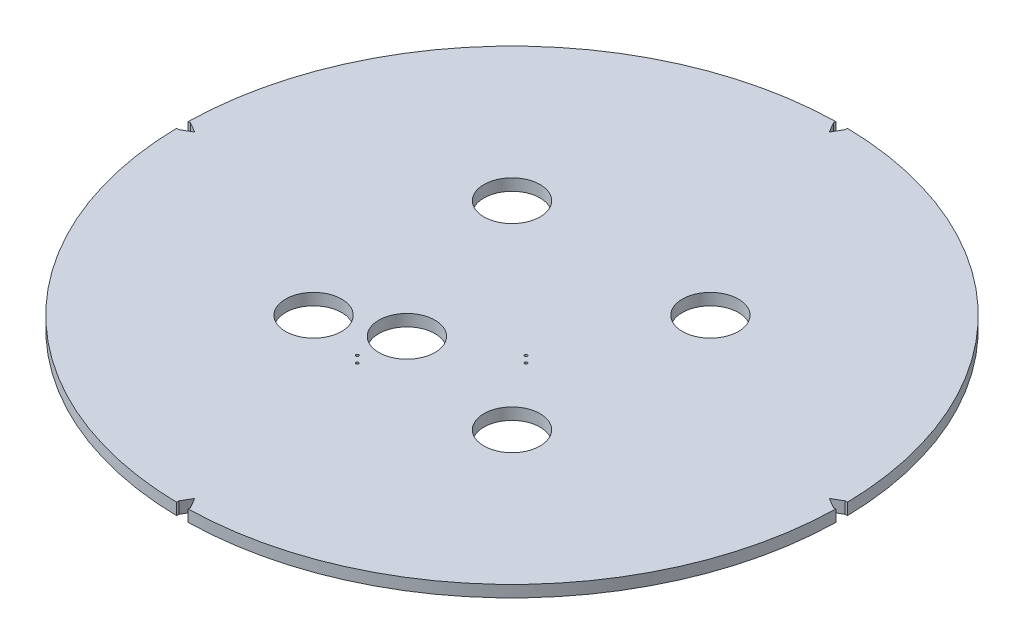
ISO-10303-21;
HEADER;
FILE_DESCRIPTION(('STEP AP214'),'2;1');
FILE_NAME('part.step','',(''),(''),'','','');
FILE_SCHEMA(('AUTOMOTIVE_DESIGN { 1 0 10303 214 1 1 1 1 }'));
ENDSEC;
DATA;
#1=APPLICATION_CONTEXT('core data for automotive mechanical design processes');
#2=APPLICATION_PROTOCOL_DEFINITION('international standard','automotive_design',2000,#1);
#3=PRODUCT_CONTEXT('',#1,'mechanical');
#4=PRODUCT('Part','Part','',(#3));
#5=PRODUCT_RELATED_PRODUCT_CATEGORY('part','',(#4));
#6=PRODUCT_DEFINITION_FORMATION('','',#4);
#7=PRODUCT_DEFINITION_CONTEXT('part definition',#1,'design');
#8=PRODUCT_DEFINITION('design','',#6,#7);
#9=PRODUCT_DEFINITION_SHAPE('','',#8);
#10=(LENGTH_UNIT() NAMED_UNIT(*) SI_UNIT(.MILLI.,.METRE.));
#11=(NAMED_UNIT(*) PLANE_ANGLE_UNIT() SI_UNIT($,.RADIAN.));
#12=(NAMED_UNIT(*) SI_UNIT($,.STERADIAN.) SOLID_ANGLE_UNIT());
#13=UNCERTAINTY_MEASURE_WITH_UNIT(LENGTH_MEASURE(1.E-05),#10,'distance_accuracy_value','');
#14=(GEOMETRIC_REPRESENTATION_CONTEXT(3) GLOBAL_UNCERTAINTY_ASSIGNED_CONTEXT((#13)) GLOBAL_UNIT_ASSIGNED_CONTEXT((#10,
#11,#12)) REPRESENTATION_CONTEXT('',''));
#15=CARTESIAN_POINT('',(0.,0.,0.));
#16=DIRECTION('',(0.,0.,1.));
#17=DIRECTION('',(1.,0.,0.));
#18=AXIS2_PLACEMENT_3D('',#15,#16,#17);
#19=CARTESIAN_POINT('',(0.,25.,0.));
#20=DIRECTION('',(0.,1.,0.));
#21=DIRECTION('',(0.,0.,1.));
#22=AXIS2_PLACEMENT_3D('',#19,#20,#21);
#23=PLANE('',#22);
#24=DIRECTION('',(1.,0.,0.));
#25=VECTOR('',#24,1.);
#26=CARTESIAN_POINT('',(-699.994189271292,25.,12.4999999999935));
#27=LINE('',#26,#25);
#28=CARTESIAN_POINT('',(-704.889175686505,25.,12.4999999999935));
#29=VERTEX_POINT('',#28);
#30=CARTESIAN_POINT('',(-699.994189271292,25.,12.4999999999935));
#31=VERTEX_POINT('',#30);
#32=EDGE_CURVE('E214',#29,#31,#27,.T.);
#33=ORIENTED_EDGE('',*,*,#32,.F.);
#34=CARTESIAN_POINT('',(0.,25.,0.));
#35=DIRECTION('',(0.,1.,0.));
#36=DIRECTION('',(0.,0.,1.));
#37=AXIS2_PLACEMENT_3D('',#34,#35,#36);
#38=CIRCLE('',#37,705.);
#39=CARTESIAN_POINT('',(-12.5000000000039,25.,704.889175686505));
#40=VERTEX_POINT('',#39);
#41=EDGE_CURVE('E45',#29,#40,#38,.T.);
#42=ORIENTED_EDGE('',*,*,#41,.T.);
#43=DIRECTION('',(0.,0.,1.));
#44=VECTOR('',#43,1.);
#45=CARTESIAN_POINT('',(-12.5000000000039,25.,699.994189271326));
#46=LINE('',#45,#44);
#47=CARTESIAN_POINT('',(-12.5000000000039,25.,699.994189271326));
#48=VERTEX_POINT('',#47);
#49=EDGE_CURVE('E295',#48,#40,#46,.T.);
#50=ORIENTED_EDGE('',*,*,#49,.F.);
#51=DIRECTION('',(-0.500000000000008,0.,0.866025403784434));
#52=VECTOR('',#51,1.);
#53=CARTESIAN_POINT('',(1.75263706108031E-11,25.,678.343554176678));
#54=LINE('',#53,#52);
#55=CARTESIAN_POINT('',(1.75263706108031E-11,25.,678.343554176678));
#56=VERTEX_POINT('',#55);
#57=EDGE_CURVE('E292',#56,#48,#54,.T.);
#58=ORIENTED_EDGE('',*,*,#57,.F.);
#59=DIRECTION('',(-0.499999999999294,0.,-0.866025403784846));
#60=VECTOR('',#59,1.);
#61=CARTESIAN_POINT('',(12.499999999996,25.,699.994189271292));
#62=LINE('',#61,#60);
#63=CARTESIAN_POINT('',(12.499999999996,25.,699.994189271292));
#64=VERTEX_POINT('',#63);
#65=EDGE_CURVE('E301',#64,#56,#62,.T.);
#66=ORIENTED_EDGE('',*,*,#65,.F.);
#67=DIRECTION('',(0.,0.,-1.));
#68=VECTOR('',#67,1.);
#69=CARTESIAN_POINT('',(12.499999999996,25.,699.994189271292));
#70=LINE('',#69,#68);
#71=CARTESIAN_POINT('',(12.499999999996,25.,704.889175686505));
#72=VERTEX_POINT('',#71);
#73=EDGE_CURVE('E298',#72,#64,#70,.T.);
#74=ORIENTED_EDGE('',*,*,#73,.F.);
#75=CARTESIAN_POINT('',(704.889175686504,25.,12.5000000000113));
#76=VERTEX_POINT('',#75);
#77=EDGE_CURVE('E11',#72,#76,#38,.T.);
#78=ORIENTED_EDGE('',*,*,#77,.T.);
#79=DIRECTION('',(1.,0.,0.));
#80=VECTOR('',#79,1.);
#81=CARTESIAN_POINT('',(699.994189271326,25.,12.5000000000112));
#82=LINE('',#81,#80);
#83=CARTESIAN_POINT('',(699.994189271326,25.,12.5000000000112));
#84=VERTEX_POINT('',#83);
#85=EDGE_CURVE('E264',#84,#76,#82,.T.);
#86=ORIENTED_EDGE('',*,*,#85,.F.);
#87=DIRECTION('',(0.866025403784428,0.,0.500000000000017));
#88=VECTOR('',#87,1.);
#89=CARTESIAN_POINT('',(678.343554176678,25.,-1.04210990286059E-11));
#90=LINE('',#89,#88);
#91=CARTESIAN_POINT('',(678.343554176678,25.,-1.04210990286059E-11));
#92=VERTEX_POINT('',#91);
#93=EDGE_CURVE('E261',#92,#84,#90,.T.);
#94=ORIENTED_EDGE('',*,*,#93,.F.);
#95=DIRECTION('',(-0.866025403784851,0.,0.499999999999285));
#96=VECTOR('',#95,1.);
#97=CARTESIAN_POINT('',(699.994189271293,25.,-12.4999999999887));
#98=LINE('',#97,#96);
#99=CARTESIAN_POINT('',(699.994189271293,25.,-12.4999999999887));
#100=VERTEX_POINT('',#99);
#101=EDGE_CURVE('E269',#100,#92,#98,.T.);
#102=ORIENTED_EDGE('',*,*,#101,.F.);
#103=DIRECTION('',(-1.,0.,0.));
#104=VECTOR('',#103,1.);
#105=CARTESIAN_POINT('',(699.994189271293,25.,-12.4999999999887));
#106=LINE('',#105,#104);
#107=CARTESIAN_POINT('',(704.889175686505,25.,-12.4999999999886));
#108=VERTEX_POINT('',#107);
#109=EDGE_CURVE('E266',#108,#100,#106,.T.);
#110=ORIENTED_EDGE('',*,*,#109,.F.);
#111=CARTESIAN_POINT('',(12.5000000000039,25.,-704.889175686505));
#112=VERTEX_POINT('',#111);
#113=EDGE_CURVE('E43',#108,#112,#38,.T.);
#114=ORIENTED_EDGE('',*,*,#113,.T.);
#115=DIRECTION('',(0.,0.,-1.));
#116=VECTOR('',#115,1.);
#117=CARTESIAN_POINT('',(12.5000000000039,25.,-699.994189271326));
#118=LINE('',#117,#116);
#119=CARTESIAN_POINT('',(12.5000000000039,25.,-699.994189271326));
#120=VERTEX_POINT('',#119);
#121=EDGE_CURVE('E237',#120,#112,#118,.T.);
#122=ORIENTED_EDGE('',*,*,#121,.F.);
#123=DIRECTION('',(0.500000000000008,0.,-0.866025403784434));
#124=VECTOR('',#123,1.);
#125=CARTESIAN_POINT('',(-1.75263706108031E-11,25.,-678.343554176678));
#126=LINE('',#125,#124);
#127=CARTESIAN_POINT('',(-1.75263706108031E-11,25.,-678.343554176678));
#128=VERTEX_POINT('',#127);
#129=EDGE_CURVE('E234',#128,#120,#126,.T.);
#130=ORIENTED_EDGE('',*,*,#129,.F.);
#131=DIRECTION('',(0.499999999999294,0.,0.866025403784846));
#132=VECTOR('',#131,1.);
#133=CARTESIAN_POINT('',(-12.499999999996,25.,-699.994189271292));
#134=LINE('',#133,#132);
#135=CARTESIAN_POINT('',(-12.499999999996,25.,-699.994189271292));
#136=VERTEX_POINT('',#135);
#137=EDGE_CURVE('E242',#136,#128,#134,.T.);
#138=ORIENTED_EDGE('',*,*,#137,.F.);
#139=DIRECTION('',(0.,0.,1.));
#140=VECTOR('',#139,1.);
#141=CARTESIAN_POINT('',(-12.499999999996,25.,-699.994189271292));
#142=LINE('',#141,#140);
#143=CARTESIAN_POINT('',(-12.499999999996,25.,-704.889175686505));
#144=VERTEX_POINT('',#143);
#145=EDGE_CURVE('E239',#144,#136,#142,.T.);
#146=ORIENTED_EDGE('',*,*,#145,.F.);
#147=CARTESIAN_POINT('',(-704.889175686505,25.,-12.5000000000064));
#148=VERTEX_POINT('',#147);
#149=EDGE_CURVE('E324',#144,#148,#38,.T.);
#150=ORIENTED_EDGE('',*,*,#149,.T.);
#151=DIRECTION('',(-1.,0.,0.));
#152=VECTOR('',#151,1.);
#153=CARTESIAN_POINT('',(-699.994189271326,25.,-12.5000000000063));
#154=LINE('',#153,#152);
#155=CARTESIAN_POINT('',(-699.994189271326,25.,-12.5000000000063));
#156=VERTEX_POINT('',#155);
#157=EDGE_CURVE('E212',#156,#148,#154,.T.);
#158=ORIENTED_EDGE('',*,*,#157,.F.);
#159=DIRECTION('',(-0.866025403784432,0.,-0.500000000000011));
#160=VECTOR('',#159,1.);
#161=CARTESIAN_POINT('',(-678.343554176678,25.,1.51579467500707E-11));
#162=LINE('',#161,#160);
#163=CARTESIAN_POINT('',(-678.343554176678,25.,1.51579467500707E-11));
#164=VERTEX_POINT('',#163);
#165=EDGE_CURVE('E182',#164,#156,#162,.T.);
#166=ORIENTED_EDGE('',*,*,#165,.F.);
#167=DIRECTION('',(0.866025403784848,0.,-0.499999999999291));
#168=VECTOR('',#167,1.);
#169=CARTESIAN_POINT('',(-699.994189271292,25.,12.4999999999935));
#170=LINE('',#169,#168);
#171=EDGE_CURVE('E184',#31,#164,#170,.T.);
#172=ORIENTED_EDGE('',*,*,#171,.F.);
#173=EDGE_LOOP('',(#33,#42,#50,#58,#66,#74,#78,#86,#94,#102,#110,#114,#122,#130,#138,#146,#150,
#158,#166,#172));
#174=FACE_BOUND('',#173,.T.);
#175=CARTESIAN_POINT('',(212.132034355964,25.,212.132034355964));
#176=DIRECTION('',(0.,1.,0.));
#177=DIRECTION('',(0.,0.,1.));
#178=AXIS2_PLACEMENT_3D('',#175,#176,#177);
#179=CIRCLE('',#178,60.);
#180=CARTESIAN_POINT('',(212.132034355964,25.,272.132034355964));
#181=VERTEX_POINT('',#180);
#182=EDGE_CURVE('E521',#181,#181,#179,.T.);
#183=ORIENTED_EDGE('',*,*,#182,.F.);
#184=EDGE_LOOP('',(#183));
#185=FACE_BOUND('',#184,.T.);
#186=CARTESIAN_POINT('',(-212.132034355964,25.,212.132034355964));
#187=DIRECTION('',(0.,1.,0.));
#188=DIRECTION('',(0.,0.,1.));
#189=AXIS2_PLACEMENT_3D('',#186,#187,#188);
#190=CIRCLE('',#189,60.);
#191=CARTESIAN_POINT('',(-212.132034355964,25.,272.132034355964));
#192=VERTEX_POINT('',#191);
#193=EDGE_CURVE('E514',#192,#192,#190,.T.);
#194=ORIENTED_EDGE('',*,*,#193,.F.);
#195=EDGE_LOOP('',(#194));
#196=FACE_BOUND('',#195,.T.);
#197=CARTESIAN_POINT('',(-212.132034355964,25.,-212.132034355964));
#198=DIRECTION('',(0.,1.,0.));
#199=DIRECTION('',(0.,0.,1.));
#200=AXIS2_PLACEMENT_3D('',#197,#198,#199);
#201=CIRCLE('',#200,60.);
#202=CARTESIAN_POINT('',(-212.132034355964,25.,-152.132034355964));
#203=VERTEX_POINT('',#202);
#204=EDGE_CURVE('E522',#203,#203,#201,.T.);
#205=ORIENTED_EDGE('',*,*,#204,.F.);
#206=EDGE_LOOP('',(#205));
#207=FACE_BOUND('',#206,.T.);
#208=CARTESIAN_POINT('',(212.132034355964,25.,-212.132034355964));
#209=DIRECTION('',(0.,1.,0.));
#210=DIRECTION('',(0.,0.,1.));
#211=AXIS2_PLACEMENT_3D('',#208,#209,#210);
#212=CIRCLE('',#211,60.);
#213=CARTESIAN_POINT('',(212.132034355964,25.,-152.132034355964));
#214=VERTEX_POINT('',#213);
#215=EDGE_CURVE('E528',#214,#214,#212,.T.);
#216=ORIENTED_EDGE('',*,*,#215,.F.);
#217=EDGE_LOOP('',(#216));
#218=FACE_BOUND('',#217,.T.);
#219=CARTESIAN_POINT('',(-73.3699843446907,25.,151.389388342512));
#220=DIRECTION('',(0.,1.,0.));
#221=DIRECTION('',(0.,0.,1.));
#222=AXIS2_PLACEMENT_3D('',#219,#220,#221);
#223=CIRCLE('',#222,60.);
#224=CARTESIAN_POINT('',(-73.3699843446907,25.,211.389388342512));
#225=VERTEX_POINT('',#224);
#226=EDGE_CURVE('E503',#225,#225,#223,.T.);
#227=ORIENTED_EDGE('',*,*,#226,.F.);
#228=EDGE_LOOP('',(#227));
#229=FACE_BOUND('',#228,.T.);
#230=CARTESIAN_POINT('',(89.2645753282152,25.,59.465506788261));
#231=DIRECTION('',(0.,-1.,0.));
#232=DIRECTION('',(0.,0.,-1.));
#233=AXIS2_PLACEMENT_3D('',#230,#231,#232);
#234=CIRCLE('',#233,3.00000000000001);
#235=CARTESIAN_POINT('',(89.2645753282152,25.,56.465506788261));
#236=VERTEX_POINT('',#235);
#237=EDGE_CURVE('E507',#236,#236,#234,.T.);
#238=ORIENTED_EDGE('',*,*,#237,.T.);
#239=EDGE_LOOP('',(#238));
#240=FACE_BOUND('',#239,.T.);
#241=CARTESIAN_POINT('',(103.406710951946,25.,73.607642411992));
#242=DIRECTION('',(0.,-1.,0.));
#243=DIRECTION('',(0.,0.,-1.));
#244=AXIS2_PLACEMENT_3D('',#241,#242,#243);
#245=CIRCLE('',#244,3.00000000000001);
#246=CARTESIAN_POINT('',(103.406710951946,25.,70.607642411992));
#247=VERTEX_POINT('',#246);
#248=EDGE_CURVE('E500',#247,#247,#245,.T.);
#249=ORIENTED_EDGE('',*,*,#248,.T.);
#250=EDGE_LOOP('',(#249));
#251=FACE_BOUND('',#250,.T.);
#252=CARTESIAN_POINT('',(-76.9055182506234,25.,253.919871614562));
#253=DIRECTION('',(0.,1.,0.));
#254=DIRECTION('',(0.,0.,1.));
#255=AXIS2_PLACEMENT_3D('',#252,#253,#254);
#256=CIRCLE('',#255,3.00000000000001);
#257=CARTESIAN_POINT('',(-76.9055182506234,25.,256.919871614562));
#258=VERTEX_POINT('',#257);
#259=EDGE_CURVE('E490',#258,#258,#256,.T.);
#260=ORIENTED_EDGE('',*,*,#259,.F.);
#261=EDGE_LOOP('',(#260));
#262=FACE_BOUND('',#261,.T.);
#263=CARTESIAN_POINT('',(-91.0476538743544,25.,239.777735990831));
#264=DIRECTION('',(0.,1.,0.));
#265=DIRECTION('',(0.,0.,1.));
#266=AXIS2_PLACEMENT_3D('',#263,#264,#265);
#267=CIRCLE('',#266,3.00000000000002);
#268=CARTESIAN_POINT('',(-91.0476538743544,25.,242.777735990831));
#269=VERTEX_POINT('',#268);
#270=EDGE_CURVE('E486',#269,#269,#267,.F.);
#271=ORIENTED_EDGE('',*,*,#270,.T.);
#272=EDGE_LOOP('',(#271));
#273=FACE_BOUND('',#272,.T.);
#274=ADVANCED_FACE('F34',(#174,#185,#196,#207,#218,#229,#240,#251,#262,#273),#23,.T.);
#275=CARTESIAN_POINT('',(0.,0.,0.));
#276=DIRECTION('',(0.,1.,0.));
#277=DIRECTION('',(0.,0.,1.));
#278=AXIS2_PLACEMENT_3D('',#275,#276,#277);
#279=PLANE('',#278);
#280=CARTESIAN_POINT('',(-76.9055182506234,0.,253.919871614562));
#281=DIRECTION('',(0.,-1.,0.));
#282=DIRECTION('',(0.,0.,-1.));
#283=AXIS2_PLACEMENT_3D('',#280,#281,#282);
#284=CIRCLE('',#283,3.00000000000001);
#285=CARTESIAN_POINT('',(-76.9055182506234,0.,250.919871614562));
#286=VERTEX_POINT('',#285);
#287=EDGE_CURVE('E491',#286,#286,#284,.T.);
#288=ORIENTED_EDGE('',*,*,#287,.F.);
#289=EDGE_LOOP('',(#288));
#290=FACE_BOUND('',#289,.T.);
#291=CARTESIAN_POINT('',(103.406710951946,0.,73.607642411992));
#292=DIRECTION('',(0.,-1.,0.));
#293=DIRECTION('',(0.,0.,-1.));
#294=AXIS2_PLACEMENT_3D('',#291,#292,#293);
#295=CIRCLE('',#294,3.00000000000001);
#296=CARTESIAN_POINT('',(103.406710951946,0.,70.607642411992));
#297=VERTEX_POINT('',#296);
#298=EDGE_CURVE('E504',#297,#297,#295,.T.);
#299=ORIENTED_EDGE('',*,*,#298,.F.);
#300=EDGE_LOOP('',(#299));
#301=FACE_BOUND('',#300,.T.);
#302=CARTESIAN_POINT('',(89.2645753282152,0.,59.465506788261));
#303=DIRECTION('',(0.,-1.,0.));
#304=DIRECTION('',(0.,0.,-1.));
#305=AXIS2_PLACEMENT_3D('',#302,#303,#304);
#306=CIRCLE('',#305,3.00000000000001);
#307=CARTESIAN_POINT('',(89.2645753282152,0.,56.465506788261));
#308=VERTEX_POINT('',#307);
#309=EDGE_CURVE('E499',#308,#308,#306,.T.);
#310=ORIENTED_EDGE('',*,*,#309,.F.);
#311=EDGE_LOOP('',(#310));
#312=FACE_BOUND('',#311,.T.);
#313=CARTESIAN_POINT('',(-73.3699843446907,0.,151.389388342512));
#314=DIRECTION('',(0.,1.,0.));
#315=DIRECTION('',(0.,0.,1.));
#316=AXIS2_PLACEMENT_3D('',#313,#314,#315);
#317=CIRCLE('',#316,60.);
#318=CARTESIAN_POINT('',(-73.3699843446907,0.,211.389388342512));
#319=VERTEX_POINT('',#318);
#320=EDGE_CURVE('E38',#319,#319,#317,.T.);
#321=ORIENTED_EDGE('',*,*,#320,.T.);
#322=EDGE_LOOP('',(#321));
#323=FACE_BOUND('',#322,.T.);
#324=CARTESIAN_POINT('',(212.132034355964,0.,-212.132034355964));
#325=DIRECTION('',(0.,1.,0.));
#326=DIRECTION('',(0.,0.,1.));
#327=AXIS2_PLACEMENT_3D('',#324,#325,#326);
#328=CIRCLE('',#327,60.);
#329=CARTESIAN_POINT('',(212.132034355964,0.,-152.132034355964));
#330=VERTEX_POINT('',#329);
#331=EDGE_CURVE('E525',#330,#330,#328,.F.);
#332=ORIENTED_EDGE('',*,*,#331,.F.);
#333=EDGE_LOOP('',(#332));
#334=FACE_BOUND('',#333,.T.);
#335=CARTESIAN_POINT('',(-212.132034355964,0.,-212.132034355964));
#336=DIRECTION('',(0.,1.,0.));
#337=DIRECTION('',(0.,0.,1.));
#338=AXIS2_PLACEMENT_3D('',#335,#336,#337);
#339=CIRCLE('',#338,60.);
#340=CARTESIAN_POINT('',(-212.132034355964,0.,-152.132034355964));
#341=VERTEX_POINT('',#340);
#342=EDGE_CURVE('E518',#341,#341,#339,.F.);
#343=ORIENTED_EDGE('',*,*,#342,.F.);
#344=EDGE_LOOP('',(#343));
#345=FACE_BOUND('',#344,.T.);
#346=CARTESIAN_POINT('',(-212.132034355964,0.,212.132034355964));
#347=DIRECTION('',(0.,1.,0.));
#348=DIRECTION('',(0.,0.,1.));
#349=AXIS2_PLACEMENT_3D('',#346,#347,#348);
#350=CIRCLE('',#349,60.);
#351=CARTESIAN_POINT('',(-212.132034355964,0.,272.132034355964));
#352=VERTEX_POINT('',#351);
#353=EDGE_CURVE('E517',#352,#352,#350,.F.);
#354=ORIENTED_EDGE('',*,*,#353,.F.);
#355=EDGE_LOOP('',(#354));
#356=FACE_BOUND('',#355,.T.);
#357=CARTESIAN_POINT('',(212.132034355964,0.,212.132034355964));
#358=DIRECTION('',(0.,1.,0.));
#359=DIRECTION('',(0.,0.,1.));
#360=AXIS2_PLACEMENT_3D('',#357,#358,#359);
#361=CIRCLE('',#360,60.);
#362=CARTESIAN_POINT('',(212.132034355964,0.,272.132034355964));
#363=VERTEX_POINT('',#362);
#364=EDGE_CURVE('E207',#363,#363,#361,.F.);
#365=ORIENTED_EDGE('',*,*,#364,.F.);
#366=EDGE_LOOP('',(#365));
#367=FACE_BOUND('',#366,.T.);
#368=CARTESIAN_POINT('',(0.,0.,0.));
#369=DIRECTION('',(0.,1.,0.));
#370=DIRECTION('',(0.,0.,1.));
#371=AXIS2_PLACEMENT_3D('',#368,#369,#370);
#372=CIRCLE('',#371,705.);
#373=CARTESIAN_POINT('',(-704.889175686505,0.,12.4999999999935));
#374=VERTEX_POINT('',#373);
#375=CARTESIAN_POINT('',(-12.5000000000039,0.,704.889175686505));
#376=VERTEX_POINT('',#375);
#377=EDGE_CURVE('E317',#374,#376,#372,.T.);
#378=ORIENTED_EDGE('',*,*,#377,.F.);
#379=DIRECTION('',(-1.,0.,0.));
#380=VECTOR('',#379,1.);
#381=CARTESIAN_POINT('',(-699.994189271292,0.,12.4999999999935));
#382=LINE('',#381,#380);
#383=CARTESIAN_POINT('',(-699.994189271292,0.,12.4999999999935));
#384=VERTEX_POINT('',#383);
#385=EDGE_CURVE('E202',#384,#374,#382,.T.);
#386=ORIENTED_EDGE('',*,*,#385,.F.);
#387=DIRECTION('',(-0.866025403784848,0.,0.499999999999291));
#388=VECTOR('',#387,1.);
#389=CARTESIAN_POINT('',(-699.994189271292,0.,12.4999999999935));
#390=LINE('',#389,#388);
#391=CARTESIAN_POINT('',(-678.343554176678,0.,1.51579467500707E-11));
#392=VERTEX_POINT('',#391);
#393=EDGE_CURVE('E199',#392,#384,#390,.T.);
#394=ORIENTED_EDGE('',*,*,#393,.F.);
#395=DIRECTION('',(0.866025403784432,0.,0.500000000000012));
#396=VECTOR('',#395,1.);
#397=CARTESIAN_POINT('',(-678.343554176678,0.,1.51579467500707E-11));
#398=LINE('',#397,#396);
#399=CARTESIAN_POINT('',(-699.994189271326,0.,-12.5000000000063));
#400=VERTEX_POINT('',#399);
#401=EDGE_CURVE('E179',#400,#392,#398,.T.);
#402=ORIENTED_EDGE('',*,*,#401,.F.);
#403=DIRECTION('',(1.,0.,0.));
#404=VECTOR('',#403,1.);
#405=CARTESIAN_POINT('',(-699.994189271326,0.,-12.5000000000063));
#406=LINE('',#405,#404);
#407=CARTESIAN_POINT('',(-704.889175686505,0.,-12.5000000000064));
#408=VERTEX_POINT('',#407);
#409=EDGE_CURVE('E186',#408,#400,#406,.T.);
#410=ORIENTED_EDGE('',*,*,#409,.F.);
#411=CARTESIAN_POINT('',(-12.499999999996,0.,-704.889175686505));
#412=VERTEX_POINT('',#411);
#413=EDGE_CURVE('E326',#412,#408,#372,.T.);
#414=ORIENTED_EDGE('',*,*,#413,.F.);
#415=DIRECTION('',(0.,0.,-1.));
#416=VECTOR('',#415,1.);
#417=CARTESIAN_POINT('',(-12.499999999996,0.,-699.994189271292));
#418=LINE('',#417,#416);
#419=CARTESIAN_POINT('',(-12.499999999996,0.,-699.994189271292));
#420=VERTEX_POINT('',#419);
#421=EDGE_CURVE('E232',#420,#412,#418,.T.);
#422=ORIENTED_EDGE('',*,*,#421,.F.);
#423=DIRECTION('',(-0.499999999999294,0.,-0.866025403784846));
#424=VECTOR('',#423,1.);
#425=CARTESIAN_POINT('',(-12.499999999996,0.,-699.994189271292));
#426=LINE('',#425,#424);
#427=CARTESIAN_POINT('',(-1.75263706108031E-11,0.,-678.343554176678));
#428=VERTEX_POINT('',#427);
#429=EDGE_CURVE('E228',#428,#420,#426,.T.);
#430=ORIENTED_EDGE('',*,*,#429,.F.);
#431=DIRECTION('',(-0.500000000000008,0.,0.866025403784434));
#432=VECTOR('',#431,1.);
#433=CARTESIAN_POINT('',(-1.75263706108031E-11,0.,-678.343554176678));
#434=LINE('',#433,#432);
#435=CARTESIAN_POINT('',(12.5000000000039,0.,-699.994189271326));
#436=VERTEX_POINT('',#435);
#437=EDGE_CURVE('E225',#436,#428,#434,.T.);
#438=ORIENTED_EDGE('',*,*,#437,.F.);
#439=DIRECTION('',(0.,0.,1.));
#440=VECTOR('',#439,1.);
#441=CARTESIAN_POINT('',(12.5000000000039,0.,-699.994189271326));
#442=LINE('',#441,#440);
#443=CARTESIAN_POINT('',(12.5000000000039,0.,-704.889175686505));
#444=VERTEX_POINT('',#443);
#445=EDGE_CURVE('E200',#444,#436,#442,.T.);
#446=ORIENTED_EDGE('',*,*,#445,.F.);
#447=CARTESIAN_POINT('',(704.889175686505,0.,-12.4999999999886));
#448=VERTEX_POINT('',#447);
#449=EDGE_CURVE('E320',#448,#444,#372,.T.);
#450=ORIENTED_EDGE('',*,*,#449,.F.);
#451=DIRECTION('',(1.,0.,0.));
#452=VECTOR('',#451,1.);
#453=CARTESIAN_POINT('',(699.994189271293,0.,-12.4999999999887));
#454=LINE('',#453,#452);
#455=CARTESIAN_POINT('',(699.994189271293,0.,-12.4999999999887));
#456=VERTEX_POINT('',#455);
#457=EDGE_CURVE('E259',#456,#448,#454,.T.);
#458=ORIENTED_EDGE('',*,*,#457,.F.);
#459=DIRECTION('',(0.866025403784851,0.,-0.499999999999285));
#460=VECTOR('',#459,1.);
#461=CARTESIAN_POINT('',(699.994189271293,0.,-12.4999999999887));
#462=LINE('',#461,#460);
#463=CARTESIAN_POINT('',(678.343554176678,0.,-1.04210990286059E-11));
#464=VERTEX_POINT('',#463);
#465=EDGE_CURVE('E256',#464,#456,#462,.T.);
#466=ORIENTED_EDGE('',*,*,#465,.F.);
#467=DIRECTION('',(-0.866025403784428,0.,-0.500000000000018));
#468=VECTOR('',#467,1.);
#469=CARTESIAN_POINT('',(678.343554176678,0.,-1.04210990286059E-11));
#470=LINE('',#469,#468);
#471=CARTESIAN_POINT('',(699.994189271326,0.,12.5000000000112));
#472=VERTEX_POINT('',#471);
#473=EDGE_CURVE('E253',#472,#464,#470,.T.);
#474=ORIENTED_EDGE('',*,*,#473,.F.);
#475=DIRECTION('',(-1.,0.,0.));
#476=VECTOR('',#475,1.);
#477=CARTESIAN_POINT('',(699.994189271326,0.,12.5000000000112));
#478=LINE('',#477,#476);
#479=CARTESIAN_POINT('',(704.889175686504,0.,12.5000000000113));
#480=VERTEX_POINT('',#479);
#481=EDGE_CURVE('E229',#480,#472,#478,.T.);
#482=ORIENTED_EDGE('',*,*,#481,.F.);
#483=CARTESIAN_POINT('',(12.499999999996,0.,704.889175686505));
#484=VERTEX_POINT('',#483);
#485=EDGE_CURVE('E318',#484,#480,#372,.T.);
#486=ORIENTED_EDGE('',*,*,#485,.F.);
#487=DIRECTION('',(0.,0.,1.));
#488=VECTOR('',#487,1.);
#489=CARTESIAN_POINT('',(12.499999999996,0.,699.994189271292));
#490=LINE('',#489,#488);
#491=CARTESIAN_POINT('',(12.499999999996,0.,699.994189271292));
#492=VERTEX_POINT('',#491);
#493=EDGE_CURVE('E290',#492,#484,#490,.T.);
#494=ORIENTED_EDGE('',*,*,#493,.F.);
#495=DIRECTION('',(0.499999999999294,0.,0.866025403784846));
#496=VECTOR('',#495,1.);
#497=CARTESIAN_POINT('',(12.499999999996,0.,699.994189271292));
#498=LINE('',#497,#496);
#499=CARTESIAN_POINT('',(1.75263706108031E-11,0.,678.343554176678));
#500=VERTEX_POINT('',#499);
#501=EDGE_CURVE('E287',#500,#492,#498,.T.);
#502=ORIENTED_EDGE('',*,*,#501,.F.);
#503=DIRECTION('',(0.500000000000008,0.,-0.866025403784434));
#504=VECTOR('',#503,1.);
#505=CARTESIAN_POINT('',(1.75263706108031E-11,0.,678.343554176678));
#506=LINE('',#505,#504);
#507=CARTESIAN_POINT('',(-12.5000000000039,0.,699.994189271326));
#508=VERTEX_POINT('',#507);
#509=EDGE_CURVE('E191',#508,#500,#506,.T.);
#510=ORIENTED_EDGE('',*,*,#509,.F.);
#511=DIRECTION('',(0.,0.,-1.));
#512=VECTOR('',#511,1.);
#513=CARTESIAN_POINT('',(-12.5000000000039,0.,699.994189271326));
#514=LINE('',#513,#512);
#515=EDGE_CURVE('E307',#376,#508,#514,.T.);
#516=ORIENTED_EDGE('',*,*,#515,.F.);
#517=EDGE_LOOP('',(#378,#386,#394,#402,#410,#414,#422,#430,#438,#446,#450,#458,#466,#474,#482,
#486,#494,#502,#510,#516));
#518=FACE_BOUND('',#517,.T.);
#519=CARTESIAN_POINT('',(-91.0476538743544,0.,239.777735990831));
#520=DIRECTION('',(0.,1.,0.));
#521=DIRECTION('',(0.,0.,1.));
#522=AXIS2_PLACEMENT_3D('',#519,#520,#521);
#523=CIRCLE('',#522,3.00000000000002);
#524=CARTESIAN_POINT('',(-91.0476538743544,0.,242.777735990831));
#525=VERTEX_POINT('',#524);
#526=EDGE_CURVE('E489',#525,#525,#523,.T.);
#527=ORIENTED_EDGE('',*,*,#526,.T.);
#528=EDGE_LOOP('',(#527));
#529=FACE_BOUND('',#528,.T.);
#530=ADVANCED_FACE('F195',(#290,#301,#312,#323,#334,#345,#356,#367,#518,#529),#279,.F.);
#531=CARTESIAN_POINT('',(0.,25.,0.));
#532=DIRECTION('',(0.,-1.,0.));
#533=DIRECTION('',(0.,0.,-1.));
#534=AXIS2_PLACEMENT_3D('',#531,#532,#533);
#535=CYLINDRICAL_SURFACE('',#534,705.);
#536=ORIENTED_EDGE('',*,*,#41,.F.);
#537=DIRECTION('',(0.,1.,0.));
#538=VECTOR('',#537,1.);
#539=CARTESIAN_POINT('',(-704.889175686505,-0.001000000000001,12.4999999999935));
#540=LINE('',#539,#538);
#541=EDGE_CURVE('E222',#374,#29,#540,.T.);
#542=ORIENTED_EDGE('',*,*,#541,.F.);
#543=ORIENTED_EDGE('',*,*,#377,.T.);
#544=DIRECTION('',(0.,1.,0.));
#545=VECTOR('',#544,1.);
#546=CARTESIAN_POINT('',(-12.5000000000039,-0.001000000000001,704.889175686505));
#547=LINE('',#546,#545);
#548=EDGE_CURVE('E312',#376,#40,#547,.T.);
#549=ORIENTED_EDGE('',*,*,#548,.T.);
#550=EDGE_LOOP('',(#536,#542,#543,#549));
#551=FACE_BOUND('',#550,.T.);
#552=ADVANCED_FACE('F393',(#551),#535,.T.);
#553=ORIENTED_EDGE('',*,*,#413,.T.);
#554=DIRECTION('',(0.,1.,0.));
#555=VECTOR('',#554,1.);
#556=CARTESIAN_POINT('',(-704.889175686505,-0.001000000000001,-12.5000000000064));
#557=LINE('',#556,#555);
#558=EDGE_CURVE('E52',#408,#148,#557,.T.);
#559=ORIENTED_EDGE('',*,*,#558,.T.);
#560=ORIENTED_EDGE('',*,*,#149,.F.);
#561=DIRECTION('',(0.,1.,0.));
#562=VECTOR('',#561,1.);
#563=CARTESIAN_POINT('',(-12.499999999996,-0.001000000000001,-704.889175686505));
#564=LINE('',#563,#562);
#565=EDGE_CURVE('E249',#412,#144,#564,.T.);
#566=ORIENTED_EDGE('',*,*,#565,.F.);
#567=EDGE_LOOP('',(#553,#559,#560,#566));
#568=FACE_BOUND('',#567,.T.);
#569=ADVANCED_FACE('F332',(#568),#535,.T.);
#570=ORIENTED_EDGE('',*,*,#449,.T.);
#571=DIRECTION('',(0.,1.,0.));
#572=VECTOR('',#571,1.);
#573=CARTESIAN_POINT('',(12.5000000000039,-0.001000000000001,-704.889175686505));
#574=LINE('',#573,#572);
#575=EDGE_CURVE('E60',#444,#112,#574,.T.);
#576=ORIENTED_EDGE('',*,*,#575,.T.);
#577=ORIENTED_EDGE('',*,*,#113,.F.);
#578=DIRECTION('',(0.,1.,0.));
#579=VECTOR('',#578,1.);
#580=CARTESIAN_POINT('',(704.889175686505,-0.001000000000001,-12.4999999999886));
#581=LINE('',#580,#579);
#582=EDGE_CURVE('E277',#448,#108,#581,.T.);
#583=ORIENTED_EDGE('',*,*,#582,.F.);
#584=EDGE_LOOP('',(#570,#576,#577,#583));
#585=FACE_BOUND('',#584,.T.);
#586=ADVANCED_FACE('F351',(#585),#535,.T.);
#587=ORIENTED_EDGE('',*,*,#485,.T.);
#588=DIRECTION('',(0.,1.,0.));
#589=VECTOR('',#588,1.);
#590=CARTESIAN_POINT('',(704.889175686504,-0.001000000000001,12.5000000000113));
#591=LINE('',#590,#589);
#592=EDGE_CURVE('E279',#480,#76,#591,.T.);
#593=ORIENTED_EDGE('',*,*,#592,.T.);
#594=ORIENTED_EDGE('',*,*,#77,.F.);
#595=DIRECTION('',(0.,1.,0.));
#596=VECTOR('',#595,1.);
#597=CARTESIAN_POINT('',(12.499999999996,-0.001000000000001,704.889175686505));
#598=LINE('',#597,#596);
#599=EDGE_CURVE('E310',#484,#72,#598,.T.);
#600=ORIENTED_EDGE('',*,*,#599,.F.);
#601=EDGE_LOOP('',(#587,#593,#594,#600));
#602=FACE_BOUND('',#601,.T.);
#603=ADVANCED_FACE('F36',(#602),#535,.T.);
#604=CARTESIAN_POINT('',(1.75263706108031E-11,-0.001000000000001,678.343554176678));
#605=DIRECTION('',(-0.866025403784434,0.,-0.500000000000008));
#606=DIRECTION('',(-0.500000000000008,0.,0.866025403784434));
#607=AXIS2_PLACEMENT_3D('',#604,#605,#606);
#608=PLANE('',#607);
#609=ORIENTED_EDGE('',*,*,#509,.T.);
#610=DIRECTION('',(0.,1.,0.));
#611=VECTOR('',#610,1.);
#612=CARTESIAN_POINT('',(1.75263706108031E-11,-0.001000000000001,678.343554176678));
#613=LINE('',#612,#611);
#614=EDGE_CURVE('E305',#500,#56,#613,.T.);
#615=ORIENTED_EDGE('',*,*,#614,.T.);
#616=ORIENTED_EDGE('',*,*,#57,.T.);
#617=DIRECTION('',(0.,1.,0.));
#618=VECTOR('',#617,1.);
#619=CARTESIAN_POINT('',(-12.5000000000039,-0.001000000000001,699.994189271326));
#620=LINE('',#619,#618);
#621=EDGE_CURVE('E304',#508,#48,#620,.T.);
#622=ORIENTED_EDGE('',*,*,#621,.F.);
#623=EDGE_LOOP('',(#609,#615,#616,#622));
#624=FACE_BOUND('',#623,.T.);
#625=ADVANCED_FACE('F386',(#624),#608,.F.);
#626=CARTESIAN_POINT('',(12.499999999996,-0.001000000000001,699.994189271292));
#627=DIRECTION('',(0.866025403784846,0.,-0.499999999999294));
#628=DIRECTION('',(-0.499999999999294,0.,-0.866025403784846));
#629=AXIS2_PLACEMENT_3D('',#626,#627,#628);
#630=PLANE('',#629);
#631=ORIENTED_EDGE('',*,*,#501,.T.);
#632=DIRECTION('',(0.,1.,0.));
#633=VECTOR('',#632,1.);
#634=CARTESIAN_POINT('',(12.499999999996,-0.001000000000001,699.994189271292));
#635=LINE('',#634,#633);
#636=EDGE_CURVE('E308',#492,#64,#635,.T.);
#637=ORIENTED_EDGE('',*,*,#636,.T.);
#638=ORIENTED_EDGE('',*,*,#65,.T.);
#639=ORIENTED_EDGE('',*,*,#614,.F.);
#640=EDGE_LOOP('',(#631,#637,#638,#639));
#641=FACE_BOUND('',#640,.T.);
#642=ADVANCED_FACE('F384',(#641),#630,.F.);
#643=CARTESIAN_POINT('',(12.499999999996,-0.001000000000001,699.994189271292));
#644=DIRECTION('',(1.,0.,0.));
#645=DIRECTION('',(0.,0.,-1.));
#646=AXIS2_PLACEMENT_3D('',#643,#644,#645);
#647=PLANE('',#646);
#648=ORIENTED_EDGE('',*,*,#493,.T.);
#649=ORIENTED_EDGE('',*,*,#599,.T.);
#650=ORIENTED_EDGE('',*,*,#73,.T.);
#651=ORIENTED_EDGE('',*,*,#636,.F.);
#652=EDGE_LOOP('',(#648,#649,#650,#651));
#653=FACE_BOUND('',#652,.T.);
#654=ADVANCED_FACE('F378',(#653),#647,.F.);
#655=CARTESIAN_POINT('',(-12.5000000000039,-0.001000000000001,699.994189271326));
#656=DIRECTION('',(-1.,0.,0.));
#657=DIRECTION('',(0.,0.,1.));
#658=AXIS2_PLACEMENT_3D('',#655,#656,#657);
#659=PLANE('',#658);
#660=ORIENTED_EDGE('',*,*,#515,.T.);
#661=ORIENTED_EDGE('',*,*,#621,.T.);
#662=ORIENTED_EDGE('',*,*,#49,.T.);
#663=ORIENTED_EDGE('',*,*,#548,.F.);
#664=EDGE_LOOP('',(#660,#661,#662,#663));
#665=FACE_BOUND('',#664,.T.);
#666=ADVANCED_FACE('F389',(#665),#659,.F.);
#667=CARTESIAN_POINT('',(678.343554176678,-0.001000000000001,-1.04210990286059E-11));
#668=DIRECTION('',(-0.500000000000018,0.,0.866025403784428));
#669=DIRECTION('',(0.866025403784428,0.,0.500000000000018));
#670=AXIS2_PLACEMENT_3D('',#667,#668,#669);
#671=PLANE('',#670);
#672=ORIENTED_EDGE('',*,*,#473,.T.);
#673=DIRECTION('',(0.,1.,0.));
#674=VECTOR('',#673,1.);
#675=CARTESIAN_POINT('',(678.343554176678,-0.001000000000001,-1.04210990286059E-11));
#676=LINE('',#675,#674);
#677=EDGE_CURVE('E273',#464,#92,#676,.T.);
#678=ORIENTED_EDGE('',*,*,#677,.T.);
#679=ORIENTED_EDGE('',*,*,#93,.T.);
#680=DIRECTION('',(0.,1.,0.));
#681=VECTOR('',#680,1.);
#682=CARTESIAN_POINT('',(699.994189271326,-0.001000000000001,12.5000000000112));
#683=LINE('',#682,#681);
#684=EDGE_CURVE('E272',#472,#84,#683,.T.);
#685=ORIENTED_EDGE('',*,*,#684,.F.);
#686=EDGE_LOOP('',(#672,#678,#679,#685));
#687=FACE_BOUND('',#686,.T.);
#688=ADVANCED_FACE('F370',(#687),#671,.F.);
#689=CARTESIAN_POINT('',(699.994189271293,-0.001000000000001,-12.4999999999887));
#690=DIRECTION('',(-0.499999999999285,0.,-0.866025403784851));
#691=DIRECTION('',(-0.866025403784851,0.,0.499999999999285));
#692=AXIS2_PLACEMENT_3D('',#689,#690,#691);
#693=PLANE('',#692);
#694=ORIENTED_EDGE('',*,*,#465,.T.);
#695=DIRECTION('',(0.,1.,0.));
#696=VECTOR('',#695,1.);
#697=CARTESIAN_POINT('',(699.994189271293,-0.001000000000001,-12.4999999999887));
#698=LINE('',#697,#696);
#699=EDGE_CURVE('E275',#456,#100,#698,.T.);
#700=ORIENTED_EDGE('',*,*,#699,.T.);
#701=ORIENTED_EDGE('',*,*,#101,.T.);
#702=ORIENTED_EDGE('',*,*,#677,.F.);
#703=EDGE_LOOP('',(#694,#700,#701,#702));
#704=FACE_BOUND('',#703,.T.);
#705=ADVANCED_FACE('F365',(#704),#693,.F.);
#706=CARTESIAN_POINT('',(699.994189271293,-0.001000000000001,-12.4999999999887));
#707=DIRECTION('',(0.,0.,-1.));
#708=DIRECTION('',(-1.,0.,0.));
#709=AXIS2_PLACEMENT_3D('',#706,#707,#708);
#710=PLANE('',#709);
#711=ORIENTED_EDGE('',*,*,#457,.T.);
#712=ORIENTED_EDGE('',*,*,#582,.T.);
#713=ORIENTED_EDGE('',*,*,#109,.T.);
#714=ORIENTED_EDGE('',*,*,#699,.F.);
#715=EDGE_LOOP('',(#711,#712,#713,#714));
#716=FACE_BOUND('',#715,.T.);
#717=ADVANCED_FACE('F356',(#716),#710,.F.);
#718=CARTESIAN_POINT('',(699.994189271326,-0.001000000000001,12.5000000000112));
#719=DIRECTION('',(0.,0.,1.));
#720=DIRECTION('',(1.,0.,0.));
#721=AXIS2_PLACEMENT_3D('',#718,#719,#720);
#722=PLANE('',#721);
#723=ORIENTED_EDGE('',*,*,#481,.T.);
#724=ORIENTED_EDGE('',*,*,#684,.T.);
#725=ORIENTED_EDGE('',*,*,#85,.T.);
#726=ORIENTED_EDGE('',*,*,#592,.F.);
#727=EDGE_LOOP('',(#723,#724,#725,#726));
#728=FACE_BOUND('',#727,.T.);
#729=ADVANCED_FACE('F372',(#728),#722,.F.);
#730=CARTESIAN_POINT('',(-1.75263706108031E-11,-0.001000000000001,-678.343554176678));
#731=DIRECTION('',(0.866025403784434,0.,0.500000000000008));
#732=DIRECTION('',(0.500000000000008,0.,-0.866025403784434));
#733=AXIS2_PLACEMENT_3D('',#730,#731,#732);
#734=PLANE('',#733);
#735=ORIENTED_EDGE('',*,*,#437,.T.);
#736=DIRECTION('',(0.,1.,0.));
#737=VECTOR('',#736,1.);
#738=CARTESIAN_POINT('',(-1.75263706108031E-11,-0.001000000000001,-678.343554176678));
#739=LINE('',#738,#737);
#740=EDGE_CURVE('E204',#428,#128,#739,.T.);
#741=ORIENTED_EDGE('',*,*,#740,.T.);
#742=ORIENTED_EDGE('',*,*,#129,.T.);
#743=DIRECTION('',(0.,1.,0.));
#744=VECTOR('',#743,1.);
#745=CARTESIAN_POINT('',(12.5000000000039,-0.001000000000001,-699.994189271326));
#746=LINE('',#745,#744);
#747=EDGE_CURVE('E245',#436,#120,#746,.T.);
#748=ORIENTED_EDGE('',*,*,#747,.F.);
#749=EDGE_LOOP('',(#735,#741,#742,#748));
#750=FACE_BOUND('',#749,.T.);
#751=ADVANCED_FACE('F346',(#750),#734,.F.);
#752=CARTESIAN_POINT('',(-12.499999999996,-0.001000000000001,-699.994189271292));
#753=DIRECTION('',(-0.866025403784846,0.,0.499999999999294));
#754=DIRECTION('',(0.499999999999294,0.,0.866025403784846));
#755=AXIS2_PLACEMENT_3D('',#752,#753,#754);
#756=PLANE('',#755);
#757=ORIENTED_EDGE('',*,*,#429,.T.);
#758=DIRECTION('',(0.,1.,0.));
#759=VECTOR('',#758,1.);
#760=CARTESIAN_POINT('',(-12.499999999996,-0.001000000000001,-699.994189271292));
#761=LINE('',#760,#759);
#762=EDGE_CURVE('E247',#420,#136,#761,.T.);
#763=ORIENTED_EDGE('',*,*,#762,.T.);
#764=ORIENTED_EDGE('',*,*,#137,.T.);
#765=ORIENTED_EDGE('',*,*,#740,.F.);
#766=EDGE_LOOP('',(#757,#763,#764,#765));
#767=FACE_BOUND('',#766,.T.);
#768=ADVANCED_FACE('F343',(#767),#756,.F.);
#769=CARTESIAN_POINT('',(-12.499999999996,-0.001000000000001,-699.994189271292));
#770=DIRECTION('',(-1.,0.,0.));
#771=DIRECTION('',(0.,0.,1.));
#772=AXIS2_PLACEMENT_3D('',#769,#770,#771);
#773=PLANE('',#772);
#774=ORIENTED_EDGE('',*,*,#421,.T.);
#775=ORIENTED_EDGE('',*,*,#565,.T.);
#776=ORIENTED_EDGE('',*,*,#145,.T.);
#777=ORIENTED_EDGE('',*,*,#762,.F.);
#778=EDGE_LOOP('',(#774,#775,#776,#777));
#779=FACE_BOUND('',#778,.T.);
#780=ADVANCED_FACE('F339',(#779),#773,.F.);
#781=CARTESIAN_POINT('',(12.5000000000039,-0.001000000000001,-699.994189271326));
#782=DIRECTION('',(1.,0.,0.));
#783=DIRECTION('',(0.,0.,-1.));
#784=AXIS2_PLACEMENT_3D('',#781,#782,#783);
#785=PLANE('',#784);
#786=ORIENTED_EDGE('',*,*,#445,.T.);
#787=ORIENTED_EDGE('',*,*,#747,.T.);
#788=ORIENTED_EDGE('',*,*,#121,.T.);
#789=ORIENTED_EDGE('',*,*,#575,.F.);
#790=EDGE_LOOP('',(#786,#787,#788,#789));
#791=FACE_BOUND('',#790,.T.);
#792=ADVANCED_FACE('F404',(#791),#785,.F.);
#793=CARTESIAN_POINT('',(-678.343554176678,-0.001000000000001,1.51579467500707E-11));
#794=DIRECTION('',(0.500000000000011,0.,-0.866025403784432));
#795=DIRECTION('',(-0.866025403784432,0.,-0.500000000000012));
#796=AXIS2_PLACEMENT_3D('',#793,#794,#795);
#797=PLANE('',#796);
#798=ORIENTED_EDGE('',*,*,#401,.T.);
#799=DIRECTION('',(0.,1.,0.));
#800=VECTOR('',#799,1.);
#801=CARTESIAN_POINT('',(-678.343554176678,-0.001000000000001,1.51579467500707E-11));
#802=LINE('',#801,#800);
#803=EDGE_CURVE('E192',#392,#164,#802,.T.);
#804=ORIENTED_EDGE('',*,*,#803,.T.);
#805=ORIENTED_EDGE('',*,*,#165,.T.);
#806=DIRECTION('',(0.,1.,0.));
#807=VECTOR('',#806,1.);
#808=CARTESIAN_POINT('',(-699.994189271326,-0.001000000000001,-12.5000000000063));
#809=LINE('',#808,#807);
#810=EDGE_CURVE('E176',#400,#156,#809,.T.);
#811=ORIENTED_EDGE('',*,*,#810,.F.);
#812=EDGE_LOOP('',(#798,#804,#805,#811));
#813=FACE_BOUND('',#812,.T.);
#814=ADVANCED_FACE('F177',(#813),#797,.F.);
#815=CARTESIAN_POINT('',(-699.994189271292,-0.001000000000001,12.4999999999935));
#816=DIRECTION('',(0.499999999999291,0.,0.866025403784848));
#817=DIRECTION('',(0.866025403784848,0.,-0.499999999999291));
#818=AXIS2_PLACEMENT_3D('',#815,#816,#817);
#819=PLANE('',#818);
#820=ORIENTED_EDGE('',*,*,#393,.T.);
#821=DIRECTION('',(0.,1.,0.));
#822=VECTOR('',#821,1.);
#823=CARTESIAN_POINT('',(-699.994189271292,-0.001000000000001,12.4999999999935));
#824=LINE('',#823,#822);
#825=EDGE_CURVE('E220',#384,#31,#824,.T.);
#826=ORIENTED_EDGE('',*,*,#825,.T.);
#827=ORIENTED_EDGE('',*,*,#171,.T.);
#828=ORIENTED_EDGE('',*,*,#803,.F.);
#829=EDGE_LOOP('',(#820,#826,#827,#828));
#830=FACE_BOUND('',#829,.T.);
#831=ADVANCED_FACE('F396',(#830),#819,.F.);
#832=CARTESIAN_POINT('',(-699.994189271292,-0.001000000000001,12.4999999999935));
#833=DIRECTION('',(0.,0.,1.));
#834=DIRECTION('',(1.,0.,0.));
#835=AXIS2_PLACEMENT_3D('',#832,#833,#834);
#836=PLANE('',#835);
#837=ORIENTED_EDGE('',*,*,#385,.T.);
#838=ORIENTED_EDGE('',*,*,#541,.T.);
#839=ORIENTED_EDGE('',*,*,#32,.T.);
#840=ORIENTED_EDGE('',*,*,#825,.F.);
#841=EDGE_LOOP('',(#837,#838,#839,#840));
#842=FACE_BOUND('',#841,.T.);
#843=ADVANCED_FACE('F391',(#842),#836,.F.);
#844=CARTESIAN_POINT('',(-699.994189271326,-0.001000000000001,-12.5000000000063));
#845=DIRECTION('',(0.,0.,-1.));
#846=DIRECTION('',(-1.,0.,0.));
#847=AXIS2_PLACEMENT_3D('',#844,#845,#846);
#848=PLANE('',#847);
#849=ORIENTED_EDGE('',*,*,#409,.T.);
#850=ORIENTED_EDGE('',*,*,#810,.T.);
#851=ORIENTED_EDGE('',*,*,#157,.T.);
#852=ORIENTED_EDGE('',*,*,#558,.F.);
#853=EDGE_LOOP('',(#849,#850,#851,#852));
#854=FACE_BOUND('',#853,.T.);
#855=ADVANCED_FACE('F187',(#854),#848,.F.);
#856=CARTESIAN_POINT('',(212.132034355964,-0.001000000000001,212.132034355964));
#857=DIRECTION('',(0.,1.,0.));
#858=DIRECTION('',(0.,0.,1.));
#859=AXIS2_PLACEMENT_3D('',#856,#857,#858);
#860=CYLINDRICAL_SURFACE('',#859,60.);
#861=ORIENTED_EDGE('',*,*,#182,.T.);
#862=EDGE_LOOP('',(#861));
#863=FACE_BOUND('',#862,.T.);
#864=ORIENTED_EDGE('',*,*,#364,.T.);
#865=EDGE_LOOP('',(#864));
#866=FACE_BOUND('',#865,.T.);
#867=ADVANCED_FACE('F440',(#863,#866),#860,.F.);
#868=CARTESIAN_POINT('',(-212.132034355964,-0.001000000000001,212.132034355964));
#869=DIRECTION('',(0.,1.,0.));
#870=DIRECTION('',(0.,0.,1.));
#871=AXIS2_PLACEMENT_3D('',#868,#869,#870);
#872=CYLINDRICAL_SURFACE('',#871,60.);
#873=ORIENTED_EDGE('',*,*,#193,.T.);
#874=EDGE_LOOP('',(#873));
#875=FACE_BOUND('',#874,.T.);
#876=ORIENTED_EDGE('',*,*,#353,.T.);
#877=EDGE_LOOP('',(#876));
#878=FACE_BOUND('',#877,.T.);
#879=ADVANCED_FACE('F444',(#875,#878),#872,.F.);
#880=CARTESIAN_POINT('',(-212.132034355964,-0.001000000000001,-212.132034355964));
#881=DIRECTION('',(0.,1.,0.));
#882=DIRECTION('',(0.,0.,1.));
#883=AXIS2_PLACEMENT_3D('',#880,#881,#882);
#884=CYLINDRICAL_SURFACE('',#883,60.);
#885=ORIENTED_EDGE('',*,*,#204,.T.);
#886=EDGE_LOOP('',(#885));
#887=FACE_BOUND('',#886,.T.);
#888=ORIENTED_EDGE('',*,*,#342,.T.);
#889=EDGE_LOOP('',(#888));
#890=FACE_BOUND('',#889,.T.);
#891=ADVANCED_FACE('F449',(#887,#890),#884,.F.);
#892=CARTESIAN_POINT('',(212.132034355964,-0.001000000000001,-212.132034355964));
#893=DIRECTION('',(0.,1.,0.));
#894=DIRECTION('',(0.,0.,1.));
#895=AXIS2_PLACEMENT_3D('',#892,#893,#894);
#896=CYLINDRICAL_SURFACE('',#895,60.);
#897=ORIENTED_EDGE('',*,*,#215,.T.);
#898=EDGE_LOOP('',(#897));
#899=FACE_BOUND('',#898,.T.);
#900=ORIENTED_EDGE('',*,*,#331,.T.);
#901=EDGE_LOOP('',(#900));
#902=FACE_BOUND('',#901,.T.);
#903=ADVANCED_FACE('F455',(#899,#902),#896,.F.);
#904=CARTESIAN_POINT('',(-73.3699843446907,-75.,151.389388342512));
#905=DIRECTION('',(0.,1.,0.));
#906=DIRECTION('',(0.,0.,1.));
#907=AXIS2_PLACEMENT_3D('',#904,#905,#906);
#908=CYLINDRICAL_SURFACE('',#907,60.);
#909=ORIENTED_EDGE('',*,*,#226,.T.);
#910=EDGE_LOOP('',(#909));
#911=FACE_BOUND('',#910,.T.);
#912=ORIENTED_EDGE('',*,*,#320,.F.);
#913=EDGE_LOOP('',(#912));
#914=FACE_BOUND('',#913,.T.);
#915=ADVANCED_FACE('F458',(#911,#914),#908,.F.);
#916=CARTESIAN_POINT('',(89.2645753282152,25.,59.465506788261));
#917=DIRECTION('',(0.,-1.,0.));
#918=DIRECTION('',(0.,0.,-1.));
#919=AXIS2_PLACEMENT_3D('',#916,#917,#918);
#920=CYLINDRICAL_SURFACE('',#919,3.00000000000001);
#921=ORIENTED_EDGE('',*,*,#237,.F.);
#922=EDGE_LOOP('',(#921));
#923=FACE_BOUND('',#922,.T.);
#924=ORIENTED_EDGE('',*,*,#309,.T.);
#925=EDGE_LOOP('',(#924));
#926=FACE_BOUND('',#925,.T.);
#927=ADVANCED_FACE('F465',(#923,#926),#920,.F.);
#928=CARTESIAN_POINT('',(103.406710951946,25.,73.607642411992));
#929=DIRECTION('',(0.,-1.,0.));
#930=DIRECTION('',(0.,0.,-1.));
#931=AXIS2_PLACEMENT_3D('',#928,#929,#930);
#932=CYLINDRICAL_SURFACE('',#931,3.00000000000001);
#933=ORIENTED_EDGE('',*,*,#248,.F.);
#934=EDGE_LOOP('',(#933));
#935=FACE_BOUND('',#934,.T.);
#936=ORIENTED_EDGE('',*,*,#298,.T.);
#937=EDGE_LOOP('',(#936));
#938=FACE_BOUND('',#937,.T.);
#939=ADVANCED_FACE('F469',(#935,#938),#932,.F.);
#940=CARTESIAN_POINT('',(-76.9055182506234,30.,253.919871614562));
#941=DIRECTION('',(0.,-1.,0.));
#942=DIRECTION('',(0.,0.,-1.));
#943=AXIS2_PLACEMENT_3D('',#940,#941,#942);
#944=CYLINDRICAL_SURFACE('',#943,3.00000000000001);
#945=ORIENTED_EDGE('',*,*,#259,.T.);
#946=EDGE_LOOP('',(#945));
#947=FACE_BOUND('',#946,.T.);
#948=ORIENTED_EDGE('',*,*,#287,.T.);
#949=EDGE_LOOP('',(#948));
#950=FACE_BOUND('',#949,.T.);
#951=ADVANCED_FACE('F473',(#947,#950),#944,.F.);
#952=CARTESIAN_POINT('',(-91.0476538743544,30.,239.777735990831));
#953=DIRECTION('',(0.,-1.,0.));
#954=DIRECTION('',(0.,0.,-1.));
#955=AXIS2_PLACEMENT_3D('',#952,#953,#954);
#956=CYLINDRICAL_SURFACE('',#955,3.00000000000002);
#957=ORIENTED_EDGE('',*,*,#270,.F.);
#958=EDGE_LOOP('',(#957));
#959=FACE_BOUND('',#958,.T.);
#960=ORIENTED_EDGE('',*,*,#526,.F.);
#961=EDGE_LOOP('',(#960));
#962=FACE_BOUND('',#961,.T.);
#963=ADVANCED_FACE('F477',(#959,#962),#956,.F.);
#964=CLOSED_SHELL('',(#274,#530,#552,#569,#586,#603,#625,#642,#654,#666,#688,#705,#717,#729,
#751,#768,#780,#792,#814,#831,#843,#855,#867,#879,#891,#903,#915,#927,#939,#951,#963));
#965=MANIFOLD_SOLID_BREP('B2',#964);
#966=ADVANCED_BREP_SHAPE_REPRESENTATION('',(#18,#965),#14);
#967=SHAPE_DEFINITION_REPRESENTATION(#9,#966);
ENDSEC;
END-ISO-10303-21;
